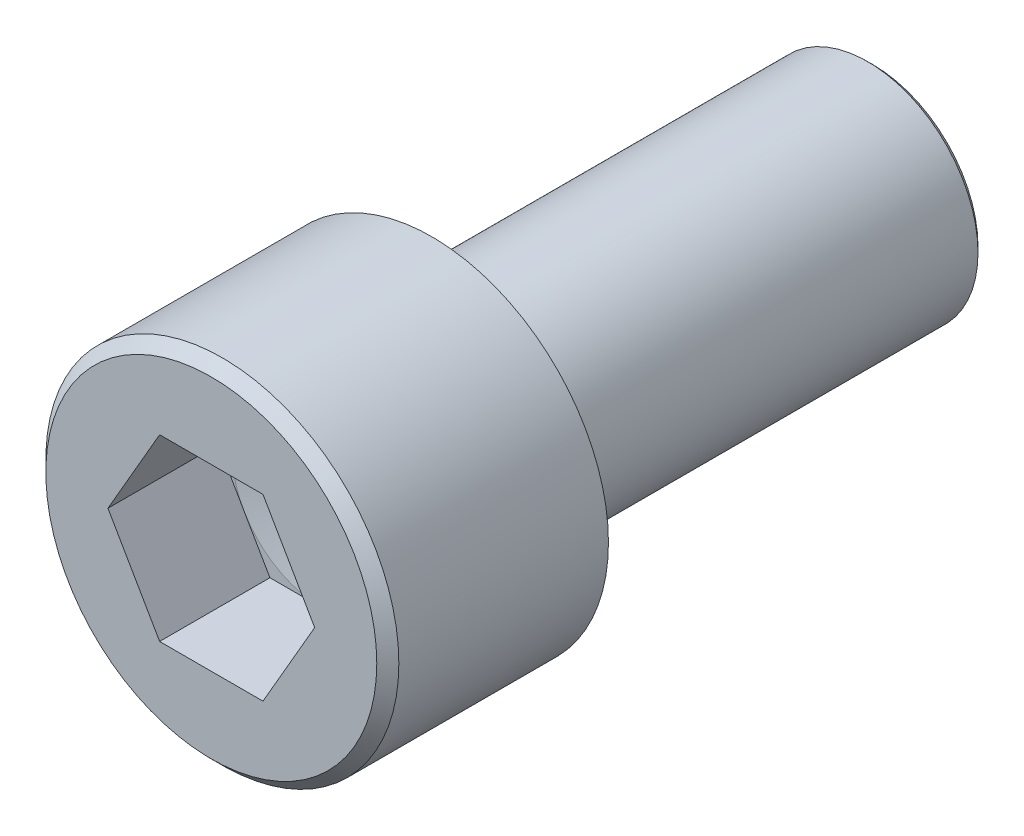
ISO-10303-21;
HEADER;
FILE_DESCRIPTION(('STEP AP214'),'2;1');
FILE_NAME('part.step','',(''),(''),'','','');
FILE_SCHEMA(('AUTOMOTIVE_DESIGN { 1 0 10303 214 1 1 1 1 }'));
ENDSEC;
DATA;
#1=APPLICATION_CONTEXT('core data for automotive mechanical design processes');
#2=APPLICATION_PROTOCOL_DEFINITION('international standard','automotive_design',2000,#1);
#3=PRODUCT_CONTEXT('',#1,'mechanical');
#4=PRODUCT('Part','Part','',(#3));
#5=PRODUCT_RELATED_PRODUCT_CATEGORY('part','',(#4));
#6=PRODUCT_DEFINITION_FORMATION('','',#4);
#7=PRODUCT_DEFINITION_CONTEXT('part definition',#1,'design');
#8=PRODUCT_DEFINITION('design','',#6,#7);
#9=PRODUCT_DEFINITION_SHAPE('','',#8);
#10=(LENGTH_UNIT() NAMED_UNIT(*) SI_UNIT(.MILLI.,.METRE.));
#11=(NAMED_UNIT(*) PLANE_ANGLE_UNIT() SI_UNIT($,.RADIAN.));
#12=(NAMED_UNIT(*) SI_UNIT($,.STERADIAN.) SOLID_ANGLE_UNIT());
#13=UNCERTAINTY_MEASURE_WITH_UNIT(LENGTH_MEASURE(1.E-05),#10,'distance_accuracy_value','');
#14=(GEOMETRIC_REPRESENTATION_CONTEXT(3) GLOBAL_UNCERTAINTY_ASSIGNED_CONTEXT((#13)) GLOBAL_UNIT_ASSIGNED_CONTEXT((#10,
#11,#12)) REPRESENTATION_CONTEXT('',''));
#15=CARTESIAN_POINT('',(0.,0.,0.));
#16=DIRECTION('',(0.,0.,1.));
#17=DIRECTION('',(1.,0.,0.));
#18=AXIS2_PLACEMENT_3D('',#15,#16,#17);
#19=CARTESIAN_POINT('',(0.,0.,5.));
#20=DIRECTION('',(0.,0.,1.));
#21=DIRECTION('',(1.,0.,0.));
#22=AXIS2_PLACEMENT_3D('',#19,#20,#21);
#23=PLANE('',#22);
#24=CARTESIAN_POINT('',(0.,0.,5.));
#25=DIRECTION('',(0.,0.,1.));
#26=DIRECTION('',(1.,0.,0.));
#27=AXIS2_PLACEMENT_3D('',#24,#25,#26);
#28=CIRCLE('',#27,4.05732901673009);
#29=CARTESIAN_POINT('',(3.51375,2.02866450836505,5.));
#30=VERTEX_POINT('',#29);
#31=CARTESIAN_POINT('',(0.,4.05732901673009,5.));
#32=VERTEX_POINT('',#31);
#33=EDGE_CURVE('E115',#30,#32,#28,.T.);
#34=ORIENTED_EDGE('',*,*,#33,.F.);
#35=DIRECTION('',(-0.5,0.866025403784439,0.));
#36=VECTOR('',#35,1.);
#37=CARTESIAN_POINT('',(4.685,0.,5.));
#38=LINE('',#37,#36);
#39=CARTESIAN_POINT('',(2.3425,4.05732901673009,5.));
#40=VERTEX_POINT('',#39);
#41=EDGE_CURVE('E143',#30,#40,#38,.T.);
#42=ORIENTED_EDGE('',*,*,#41,.T.);
#43=DIRECTION('',(-1.,0.,0.));
#44=VECTOR('',#43,1.);
#45=CARTESIAN_POINT('',(2.3425,4.05732901673009,5.));
#46=LINE('',#45,#44);
#47=EDGE_CURVE('E139',#40,#32,#46,.T.);
#48=ORIENTED_EDGE('',*,*,#47,.T.);
#49=EDGE_LOOP('',(#34,#42,#48));
#50=FACE_BOUND('',#49,.T.);
#51=ADVANCED_FACE('F36',(#50),#23,.T.);
#52=CARTESIAN_POINT('',(0.,0.,5.));
#53=DIRECTION('',(0.,0.,1.));
#54=DIRECTION('',(1.,0.,0.));
#55=AXIS2_PLACEMENT_3D('',#52,#53,#54);
#56=CIRCLE('',#55,4.05732901673009);
#57=CARTESIAN_POINT('',(-3.51375,2.02866450836505,5.));
#58=VERTEX_POINT('',#57);
#59=EDGE_CURVE('E117',#32,#58,#56,.T.);
#60=ORIENTED_EDGE('',*,*,#59,.F.);
#61=CARTESIAN_POINT('',(-2.3425,4.05732901673009,5.));
#62=VERTEX_POINT('',#61);
#63=EDGE_CURVE('E128',#32,#62,#46,.T.);
#64=ORIENTED_EDGE('',*,*,#63,.T.);
#65=DIRECTION('',(-0.5,-0.866025403784439,0.));
#66=VECTOR('',#65,1.);
#67=CARTESIAN_POINT('',(-2.3425,4.05732901673009,5.));
#68=LINE('',#67,#66);
#69=EDGE_CURVE('E131',#62,#58,#68,.T.);
#70=ORIENTED_EDGE('',*,*,#69,.T.);
#71=EDGE_LOOP('',(#60,#64,#70));
#72=FACE_BOUND('',#71,.T.);
#73=ADVANCED_FACE('F127',(#72),#23,.T.);
#74=CARTESIAN_POINT('',(-3.51375,-2.02866450836505,5.));
#75=VERTEX_POINT('',#74);
#76=EDGE_CURVE('E133',#58,#75,#56,.T.);
#77=ORIENTED_EDGE('',*,*,#76,.F.);
#78=CARTESIAN_POINT('',(-4.685,0.,5.));
#79=VERTEX_POINT('',#78);
#80=EDGE_CURVE('E166',#58,#79,#68,.T.);
#81=ORIENTED_EDGE('',*,*,#80,.T.);
#82=DIRECTION('',(0.5,-0.866025403784439,0.));
#83=VECTOR('',#82,1.);
#84=CARTESIAN_POINT('',(-4.685,0.,5.));
#85=LINE('',#84,#83);
#86=EDGE_CURVE('E242',#79,#75,#85,.T.);
#87=ORIENTED_EDGE('',*,*,#86,.T.);
#88=EDGE_LOOP('',(#77,#81,#87));
#89=FACE_BOUND('',#88,.T.);
#90=ADVANCED_FACE('F207',(#89),#23,.T.);
#91=CARTESIAN_POINT('',(0.,-4.05732901673009,5.));
#92=VERTEX_POINT('',#91);
#93=EDGE_CURVE('E237',#75,#92,#56,.T.);
#94=ORIENTED_EDGE('',*,*,#93,.F.);
#95=CARTESIAN_POINT('',(-2.3425,-4.05732901673009,5.));
#96=VERTEX_POINT('',#95);
#97=EDGE_CURVE('E246',#75,#96,#85,.T.);
#98=ORIENTED_EDGE('',*,*,#97,.T.);
#99=DIRECTION('',(1.,0.,0.));
#100=VECTOR('',#99,1.);
#101=CARTESIAN_POINT('',(-2.3425,-4.05732901673009,5.));
#102=LINE('',#101,#100);
#103=EDGE_CURVE('E241',#96,#92,#102,.T.);
#104=ORIENTED_EDGE('',*,*,#103,.T.);
#105=EDGE_LOOP('',(#94,#98,#104));
#106=FACE_BOUND('',#105,.T.);
#107=ADVANCED_FACE('F221',(#106),#23,.T.);
#108=CARTESIAN_POINT('',(3.51375,-2.02866450836505,5.));
#109=VERTEX_POINT('',#108);
#110=EDGE_CURVE('E51',#92,#109,#56,.T.);
#111=ORIENTED_EDGE('',*,*,#110,.F.);
#112=CARTESIAN_POINT('',(2.3425,-4.05732901673009,5.));
#113=VERTEX_POINT('',#112);
#114=EDGE_CURVE('E233',#92,#113,#102,.T.);
#115=ORIENTED_EDGE('',*,*,#114,.T.);
#116=DIRECTION('',(0.5,0.866025403784439,0.));
#117=VECTOR('',#116,1.);
#118=CARTESIAN_POINT('',(2.3425,-4.05732901673009,5.));
#119=LINE('',#118,#117);
#120=EDGE_CURVE('E236',#113,#109,#119,.T.);
#121=ORIENTED_EDGE('',*,*,#120,.T.);
#122=EDGE_LOOP('',(#111,#115,#121));
#123=FACE_BOUND('',#122,.T.);
#124=ADVANCED_FACE('F212',(#123),#23,.T.);
#125=CARTESIAN_POINT('',(0.,0.,10.));
#126=DIRECTION('',(0.,0.,-1.));
#127=DIRECTION('',(-1.,0.,0.));
#128=AXIS2_PLACEMENT_3D('',#125,#126,#127);
#129=CYLINDRICAL_SURFACE('',#128,8.);
#130=CARTESIAN_POINT('',(0.,0.,9.50000000000001));
#131=DIRECTION('',(0.,0.,1.));
#132=DIRECTION('',(1.,0.,0.));
#133=AXIS2_PLACEMENT_3D('',#130,#131,#132);
#134=CIRCLE('',#133,8.);
#135=CARTESIAN_POINT('',(8.,0.,9.50000000000001));
#136=VERTEX_POINT('',#135);
#137=EDGE_CURVE('E181',#136,#136,#134,.F.);
#138=ORIENTED_EDGE('',*,*,#137,.T.);
#139=EDGE_LOOP('',(#138));
#140=FACE_BOUND('',#139,.T.);
#141=CARTESIAN_POINT('',(0.,0.,0.));
#142=DIRECTION('',(0.,0.,1.));
#143=DIRECTION('',(1.,0.,0.));
#144=AXIS2_PLACEMENT_3D('',#141,#142,#143);
#145=CIRCLE('',#144,8.);
#146=CARTESIAN_POINT('',(8.,0.,0.));
#147=VERTEX_POINT('',#146);
#148=EDGE_CURVE('E168',#147,#147,#145,.T.);
#149=ORIENTED_EDGE('',*,*,#148,.T.);
#150=EDGE_LOOP('',(#149));
#151=FACE_BOUND('',#150,.T.);
#152=ADVANCED_FACE('F220',(#140,#151),#129,.T.);
#153=CARTESIAN_POINT('',(0.,0.,10.));
#154=DIRECTION('',(0.,0.,1.));
#155=DIRECTION('',(1.,0.,0.));
#156=AXIS2_PLACEMENT_3D('',#153,#154,#155);
#157=PLANE('',#156);
#158=DIRECTION('',(-0.5,-0.866025403784439,0.));
#159=VECTOR('',#158,1.);
#160=CARTESIAN_POINT('',(-2.3425,4.05732901673009,10.));
#161=LINE('',#160,#159);
#162=CARTESIAN_POINT('',(-2.3425,4.05732901673009,10.));
#163=VERTEX_POINT('',#162);
#164=CARTESIAN_POINT('',(-4.685,0.,10.));
#165=VERTEX_POINT('',#164);
#166=EDGE_CURVE('E59',#163,#165,#161,.T.);
#167=ORIENTED_EDGE('',*,*,#166,.F.);
#168=DIRECTION('',(-1.,0.,0.));
#169=VECTOR('',#168,1.);
#170=CARTESIAN_POINT('',(2.3425,4.05732901673009,10.));
#171=LINE('',#170,#169);
#172=CARTESIAN_POINT('',(2.3425,4.05732901673009,10.));
#173=VERTEX_POINT('',#172);
#174=EDGE_CURVE('E164',#173,#163,#171,.T.);
#175=ORIENTED_EDGE('',*,*,#174,.F.);
#176=DIRECTION('',(-0.5,0.866025403784439,0.));
#177=VECTOR('',#176,1.);
#178=CARTESIAN_POINT('',(4.685,0.,10.));
#179=LINE('',#178,#177);
#180=CARTESIAN_POINT('',(4.685,0.,10.));
#181=VERTEX_POINT('',#180);
#182=EDGE_CURVE('E161',#181,#173,#179,.T.);
#183=ORIENTED_EDGE('',*,*,#182,.F.);
#184=DIRECTION('',(0.5,0.866025403784439,0.));
#185=VECTOR('',#184,1.);
#186=CARTESIAN_POINT('',(2.3425,-4.05732901673009,10.));
#187=LINE('',#186,#185);
#188=CARTESIAN_POINT('',(2.3425,-4.05732901673009,10.));
#189=VERTEX_POINT('',#188);
#190=EDGE_CURVE('E158',#189,#181,#187,.T.);
#191=ORIENTED_EDGE('',*,*,#190,.F.);
#192=DIRECTION('',(1.,0.,0.));
#193=VECTOR('',#192,1.);
#194=CARTESIAN_POINT('',(-2.3425,-4.05732901673009,10.));
#195=LINE('',#194,#193);
#196=CARTESIAN_POINT('',(-2.3425,-4.05732901673009,10.));
#197=VERTEX_POINT('',#196);
#198=EDGE_CURVE('E155',#197,#189,#195,.T.);
#199=ORIENTED_EDGE('',*,*,#198,.F.);
#200=DIRECTION('',(0.5,-0.866025403784439,0.));
#201=VECTOR('',#200,1.);
#202=CARTESIAN_POINT('',(-4.685,0.,10.));
#203=LINE('',#202,#201);
#204=EDGE_CURVE('E152',#165,#197,#203,.T.);
#205=ORIENTED_EDGE('',*,*,#204,.F.);
#206=EDGE_LOOP('',(#167,#175,#183,#191,#199,#205));
#207=FACE_BOUND('',#206,.T.);
#208=CARTESIAN_POINT('',(0.,0.,10.));
#209=DIRECTION('',(0.,0.,1.));
#210=DIRECTION('',(1.,0.,0.));
#211=AXIS2_PLACEMENT_3D('',#208,#209,#210);
#212=CIRCLE('',#211,7.50000000000001);
#213=CARTESIAN_POINT('',(7.50000000000001,0.,10.));
#214=VERTEX_POINT('',#213);
#215=EDGE_CURVE('E178',#214,#214,#212,.T.);
#216=ORIENTED_EDGE('',*,*,#215,.T.);
#217=EDGE_LOOP('',(#216));
#218=FACE_BOUND('',#217,.T.);
#219=ADVANCED_FACE('F227',(#207,#218),#157,.T.);
#220=CARTESIAN_POINT('',(0.,0.,0.));
#221=DIRECTION('',(0.,0.,1.));
#222=DIRECTION('',(1.,0.,0.));
#223=AXIS2_PLACEMENT_3D('',#220,#221,#222);
#224=PLANE('',#223);
#225=CARTESIAN_POINT('',(0.,0.,0.));
#226=DIRECTION('',(0.,0.,1.));
#227=DIRECTION('',(1.,0.,0.));
#228=AXIS2_PLACEMENT_3D('',#225,#226,#227);
#229=CIRCLE('',#228,5.25);
#230=CARTESIAN_POINT('',(5.25,0.,0.));
#231=VERTEX_POINT('',#230);
#232=EDGE_CURVE('E132',#231,#231,#229,.T.);
#233=ORIENTED_EDGE('',*,*,#232,.T.);
#234=EDGE_LOOP('',(#233));
#235=FACE_BOUND('',#234,.T.);
#236=ORIENTED_EDGE('',*,*,#148,.F.);
#237=EDGE_LOOP('',(#236));
#238=FACE_BOUND('',#237,.T.);
#239=ADVANCED_FACE('F312',(#235,#238),#224,.F.);
#240=CARTESIAN_POINT('',(0.,0.,10.));
#241=DIRECTION('',(0.,0.,-1.));
#242=DIRECTION('',(-1.,0.,0.));
#243=AXIS2_PLACEMENT_3D('',#240,#241,#242);
#244=CONICAL_SURFACE('',#243,7.50000000000001,0.78539816339745);
#245=ORIENTED_EDGE('',*,*,#137,.F.);
#246=EDGE_LOOP('',(#245));
#247=FACE_BOUND('',#246,.T.);
#248=ORIENTED_EDGE('',*,*,#215,.F.);
#249=EDGE_LOOP('',(#248));
#250=FACE_BOUND('',#249,.T.);
#251=ADVANCED_FACE('F317',(#247,#250),#244,.T.);
#252=CARTESIAN_POINT('',(-2.3425,4.05732901673009,5.));
#253=DIRECTION('',(-0.866025403784439,0.5,0.));
#254=DIRECTION('',(-0.5,-0.866025403784439,0.));
#255=AXIS2_PLACEMENT_3D('',#252,#253,#254);
#256=PLANE('',#255);
#257=ORIENTED_EDGE('',*,*,#166,.T.);
#258=DIRECTION('',(0.,0.,1.));
#259=VECTOR('',#258,1.);
#260=CARTESIAN_POINT('',(-4.685,0.,5.));
#261=LINE('',#260,#259);
#262=EDGE_CURVE('E145',#79,#165,#261,.T.);
#263=ORIENTED_EDGE('',*,*,#262,.F.);
#264=ORIENTED_EDGE('',*,*,#80,.F.);
#265=ORIENTED_EDGE('',*,*,#69,.F.);
#266=DIRECTION('',(0.,0.,1.));
#267=VECTOR('',#266,1.);
#268=CARTESIAN_POINT('',(-2.3425,4.05732901673009,5.));
#269=LINE('',#268,#267);
#270=EDGE_CURVE('E140',#62,#163,#269,.T.);
#271=ORIENTED_EDGE('',*,*,#270,.T.);
#272=EDGE_LOOP('',(#257,#263,#264,#265,#271));
#273=FACE_BOUND('',#272,.T.);
#274=ADVANCED_FACE('F267',(#273),#256,.F.);
#275=CARTESIAN_POINT('',(2.3425,4.05732901673009,5.));
#276=DIRECTION('',(0.,1.,0.));
#277=DIRECTION('',(0.,0.,1.));
#278=AXIS2_PLACEMENT_3D('',#275,#276,#277);
#279=PLANE('',#278);
#280=ORIENTED_EDGE('',*,*,#174,.T.);
#281=ORIENTED_EDGE('',*,*,#270,.F.);
#282=ORIENTED_EDGE('',*,*,#63,.F.);
#283=ORIENTED_EDGE('',*,*,#47,.F.);
#284=DIRECTION('',(0.,0.,1.));
#285=VECTOR('',#284,1.);
#286=CARTESIAN_POINT('',(2.3425,4.05732901673009,5.));
#287=LINE('',#286,#285);
#288=EDGE_CURVE('E169',#40,#173,#287,.T.);
#289=ORIENTED_EDGE('',*,*,#288,.T.);
#290=EDGE_LOOP('',(#280,#281,#282,#283,#289));
#291=FACE_BOUND('',#290,.T.);
#292=ADVANCED_FACE('F138',(#291),#279,.F.);
#293=CARTESIAN_POINT('',(4.685,0.,5.));
#294=DIRECTION('',(0.866025403784438,0.5,0.));
#295=DIRECTION('',(-0.5,0.866025403784438,0.));
#296=AXIS2_PLACEMENT_3D('',#293,#294,#295);
#297=PLANE('',#296);
#298=ORIENTED_EDGE('',*,*,#182,.T.);
#299=ORIENTED_EDGE('',*,*,#288,.F.);
#300=ORIENTED_EDGE('',*,*,#41,.F.);
#301=CARTESIAN_POINT('',(4.685,0.,5.));
#302=VERTEX_POINT('',#301);
#303=EDGE_CURVE('E141',#302,#30,#38,.T.);
#304=ORIENTED_EDGE('',*,*,#303,.F.);
#305=DIRECTION('',(0.,0.,1.));
#306=VECTOR('',#305,1.);
#307=CARTESIAN_POINT('',(4.685,0.,5.));
#308=LINE('',#307,#306);
#309=EDGE_CURVE('E171',#302,#181,#308,.T.);
#310=ORIENTED_EDGE('',*,*,#309,.T.);
#311=EDGE_LOOP('',(#298,#299,#300,#304,#310));
#312=FACE_BOUND('',#311,.T.);
#313=ADVANCED_FACE('F256',(#312),#297,.F.);
#314=CARTESIAN_POINT('',(2.3425,-4.05732901673009,5.));
#315=DIRECTION('',(0.866025403784439,-0.5,0.));
#316=DIRECTION('',(0.5,0.866025403784439,0.));
#317=AXIS2_PLACEMENT_3D('',#314,#315,#316);
#318=PLANE('',#317);
#319=ORIENTED_EDGE('',*,*,#190,.T.);
#320=ORIENTED_EDGE('',*,*,#309,.F.);
#321=EDGE_CURVE('E248',#109,#302,#119,.T.);
#322=ORIENTED_EDGE('',*,*,#321,.F.);
#323=ORIENTED_EDGE('',*,*,#120,.F.);
#324=DIRECTION('',(0.,0.,1.));
#325=VECTOR('',#324,1.);
#326=CARTESIAN_POINT('',(2.3425,-4.05732901673009,5.));
#327=LINE('',#326,#325);
#328=EDGE_CURVE('E173',#113,#189,#327,.T.);
#329=ORIENTED_EDGE('',*,*,#328,.T.);
#330=EDGE_LOOP('',(#319,#320,#322,#323,#329));
#331=FACE_BOUND('',#330,.T.);
#332=ADVANCED_FACE('F352',(#331),#318,.F.);
#333=CARTESIAN_POINT('',(-2.3425,-4.05732901673009,5.));
#334=DIRECTION('',(0.,-1.,0.));
#335=DIRECTION('',(1.,0.,0.));
#336=AXIS2_PLACEMENT_3D('',#333,#334,#335);
#337=PLANE('',#336);
#338=ORIENTED_EDGE('',*,*,#198,.T.);
#339=ORIENTED_EDGE('',*,*,#328,.F.);
#340=ORIENTED_EDGE('',*,*,#114,.F.);
#341=ORIENTED_EDGE('',*,*,#103,.F.);
#342=DIRECTION('',(0.,0.,1.));
#343=VECTOR('',#342,1.);
#344=CARTESIAN_POINT('',(-2.3425,-4.05732901673009,5.));
#345=LINE('',#344,#343);
#346=EDGE_CURVE('E146',#96,#197,#345,.T.);
#347=ORIENTED_EDGE('',*,*,#346,.T.);
#348=EDGE_LOOP('',(#338,#339,#340,#341,#347));
#349=FACE_BOUND('',#348,.T.);
#350=ADVANCED_FACE('F216',(#349),#337,.F.);
#351=CARTESIAN_POINT('',(-4.685,0.,5.));
#352=DIRECTION('',(-0.866025403784439,-0.5,0.));
#353=DIRECTION('',(0.5,-0.866025403784439,0.));
#354=AXIS2_PLACEMENT_3D('',#351,#352,#353);
#355=PLANE('',#354);
#356=ORIENTED_EDGE('',*,*,#204,.T.);
#357=ORIENTED_EDGE('',*,*,#346,.F.);
#358=ORIENTED_EDGE('',*,*,#97,.F.);
#359=ORIENTED_EDGE('',*,*,#86,.F.);
#360=ORIENTED_EDGE('',*,*,#262,.T.);
#361=EDGE_LOOP('',(#356,#357,#358,#359,#360));
#362=FACE_BOUND('',#361,.T.);
#363=ADVANCED_FACE('F210',(#362),#355,.F.);
#364=EDGE_CURVE('E119',#109,#30,#56,.T.);
#365=ORIENTED_EDGE('',*,*,#364,.F.);
#366=ORIENTED_EDGE('',*,*,#321,.T.);
#367=ORIENTED_EDGE('',*,*,#303,.T.);
#368=EDGE_LOOP('',(#365,#366,#367));
#369=FACE_BOUND('',#368,.T.);
#370=ADVANCED_FACE('F112',(#369),#23,.T.);
#371=CARTESIAN_POINT('',(0.,0.,5.));
#372=DIRECTION('',(0.,0.,1.));
#373=DIRECTION('',(1.,0.,0.));
#374=AXIS2_PLACEMENT_3D('',#371,#372,#373);
#375=CONICAL_SURFACE('',#374,4.05732901673009,1.39626340159547);
#376=CARTESIAN_POINT('',(0.,0.,4.28458342473915));
#377=VERTEX_POINT('',#376);
#378=VERTEX_LOOP('',#377);
#379=FACE_BOUND('',#378,.T.);
#380=ORIENTED_EDGE('',*,*,#33,.T.);
#381=ORIENTED_EDGE('',*,*,#59,.T.);
#382=ORIENTED_EDGE('',*,*,#76,.T.);
#383=ORIENTED_EDGE('',*,*,#93,.T.);
#384=ORIENTED_EDGE('',*,*,#110,.T.);
#385=ORIENTED_EDGE('',*,*,#364,.T.);
#386=EDGE_LOOP('',(#380,#381,#382,#383,#384,#385));
#387=FACE_BOUND('',#386,.T.);
#388=ADVANCED_FACE('F109',(#379,#387),#375,.F.);
#389=CARTESIAN_POINT('',(0.,0.,0.));
#390=DIRECTION('',(0.,0.,1.));
#391=DIRECTION('',(1.,0.,0.));
#392=AXIS2_PLACEMENT_3D('',#389,#390,#391);
#393=CYLINDRICAL_SURFACE('',#392,5.);
#394=CARTESIAN_POINT('',(0.,0.,-19.75));
#395=DIRECTION('',(0.,0.,-1.));
#396=DIRECTION('',(-1.,0.,0.));
#397=AXIS2_PLACEMENT_3D('',#394,#395,#396);
#398=CIRCLE('',#397,5.);
#399=CARTESIAN_POINT('',(-5.,0.,-19.75));
#400=VERTEX_POINT('',#399);
#401=EDGE_CURVE('E44',#400,#400,#398,.F.);
#402=ORIENTED_EDGE('',*,*,#401,.T.);
#403=EDGE_LOOP('',(#402));
#404=FACE_BOUND('',#403,.T.);
#405=CARTESIAN_POINT('',(0.,0.,-0.25));
#406=DIRECTION('',(0.,0.,1.));
#407=DIRECTION('',(1.,0.,0.));
#408=AXIS2_PLACEMENT_3D('',#405,#406,#407);
#409=CIRCLE('',#408,5.);
#410=CARTESIAN_POINT('',(5.,0.,-0.25));
#411=VERTEX_POINT('',#410);
#412=EDGE_CURVE('E186',#411,#411,#409,.F.);
#413=ORIENTED_EDGE('',*,*,#412,.T.);
#414=EDGE_LOOP('',(#413));
#415=FACE_BOUND('',#414,.T.);
#416=ADVANCED_FACE('F111',(#404,#415),#393,.T.);
#417=CARTESIAN_POINT('',(0.,0.,-20.));
#418=DIRECTION('',(0.,0.,-1.));
#419=DIRECTION('',(-1.,0.,0.));
#420=AXIS2_PLACEMENT_3D('',#417,#418,#419);
#421=PLANE('',#420);
#422=CARTESIAN_POINT('',(0.,0.,-20.));
#423=DIRECTION('',(0.,0.,-1.));
#424=DIRECTION('',(-1.,0.,0.));
#425=AXIS2_PLACEMENT_3D('',#422,#423,#424);
#426=CIRCLE('',#425,4.75000000000001);
#427=CARTESIAN_POINT('',(-4.75000000000001,0.,-20.));
#428=VERTEX_POINT('',#427);
#429=EDGE_CURVE('E11',#428,#428,#426,.T.);
#430=ORIENTED_EDGE('',*,*,#429,.T.);
#431=EDGE_LOOP('',(#430));
#432=FACE_BOUND('',#431,.T.);
#433=ADVANCED_FACE('F199',(#432),#421,.T.);
#434=CARTESIAN_POINT('',(0.,0.,-0.25));
#435=DIRECTION('',(0.,0.,1.));
#436=DIRECTION('',(1.,0.,0.));
#437=AXIS2_PLACEMENT_3D('',#434,#435,#436);
#438=TOROIDAL_SURFACE('',#437,5.25,0.25);
#439=ORIENTED_EDGE('',*,*,#412,.F.);
#440=EDGE_LOOP('',(#439));
#441=FACE_BOUND('',#440,.T.);
#442=ORIENTED_EDGE('',*,*,#232,.F.);
#443=EDGE_LOOP('',(#442));
#444=FACE_BOUND('',#443,.T.);
#445=ADVANCED_FACE('F194',(#441,#444),#438,.F.);
#446=CARTESIAN_POINT('',(0.,0.,-19.75));
#447=DIRECTION('',(0.,0.,1.));
#448=DIRECTION('',(1.,0.,0.));
#449=AXIS2_PLACEMENT_3D('',#446,#447,#448);
#450=CONICAL_SURFACE('',#449,5.,0.785398163397453);
#451=ORIENTED_EDGE('',*,*,#429,.F.);
#452=EDGE_LOOP('',(#451));
#453=FACE_BOUND('',#452,.T.);
#454=ORIENTED_EDGE('',*,*,#401,.F.);
#455=EDGE_LOOP('',(#454));
#456=FACE_BOUND('',#455,.T.);
#457=ADVANCED_FACE('F38',(#453,#456),#450,.T.);
#458=CLOSED_SHELL('',(#51,#73,#90,#107,#124,#152,#219,#239,#251,#274,#292,#313,#332,#350,#363,
#370,#388,#416,#433,#445,#457));
#459=MANIFOLD_SOLID_BREP('B2',#458);
#460=ADVANCED_BREP_SHAPE_REPRESENTATION('',(#18,#459),#14);
#461=SHAPE_DEFINITION_REPRESENTATION(#9,#460);
ENDSEC;
END-ISO-10303-21;
